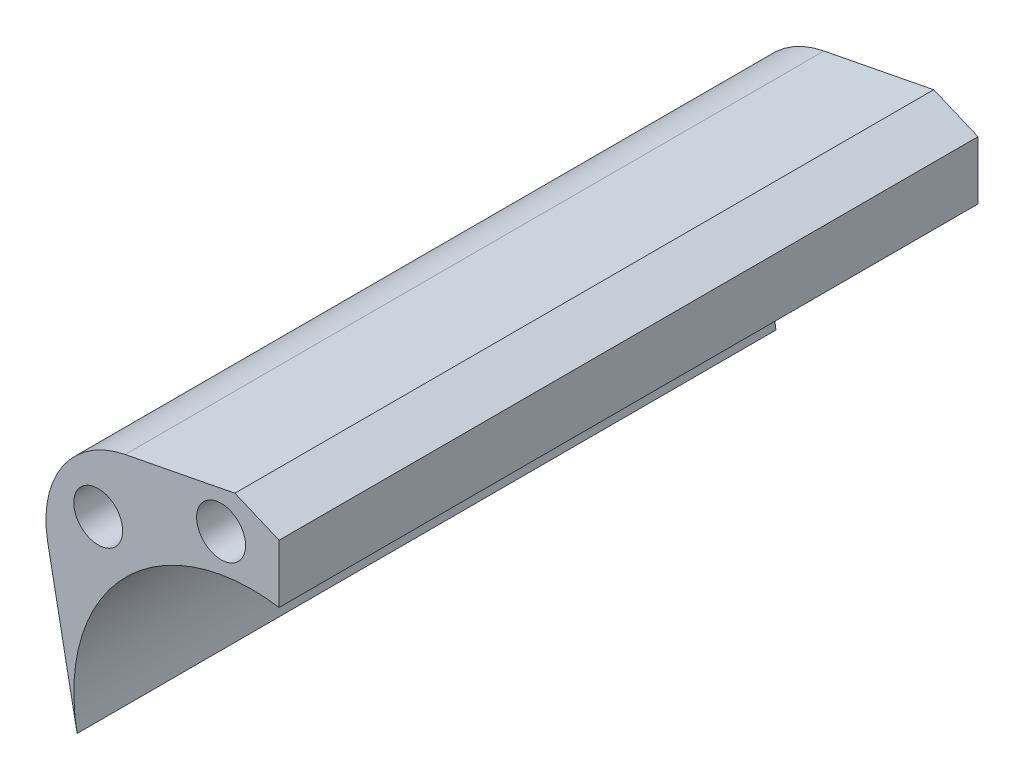
ISO-10303-21;
HEADER;
FILE_DESCRIPTION(('STEP AP214'),'2;1');
FILE_NAME('part.step','',(''),(''),'','','');
FILE_SCHEMA(('AUTOMOTIVE_DESIGN { 1 0 10303 214 1 1 1 1 }'));
ENDSEC;
DATA;
#1=APPLICATION_CONTEXT('core data for automotive mechanical design processes');
#2=APPLICATION_PROTOCOL_DEFINITION('international standard','automotive_design',2000,#1);
#3=PRODUCT_CONTEXT('',#1,'mechanical');
#4=PRODUCT('Part','Part','',(#3));
#5=PRODUCT_RELATED_PRODUCT_CATEGORY('part','',(#4));
#6=PRODUCT_DEFINITION_FORMATION('','',#4);
#7=PRODUCT_DEFINITION_CONTEXT('part definition',#1,'design');
#8=PRODUCT_DEFINITION('design','',#6,#7);
#9=PRODUCT_DEFINITION_SHAPE('','',#8);
#10=(LENGTH_UNIT() NAMED_UNIT(*) SI_UNIT(.MILLI.,.METRE.));
#11=(NAMED_UNIT(*) PLANE_ANGLE_UNIT() SI_UNIT($,.RADIAN.));
#12=(NAMED_UNIT(*) SI_UNIT($,.STERADIAN.) SOLID_ANGLE_UNIT());
#13=UNCERTAINTY_MEASURE_WITH_UNIT(LENGTH_MEASURE(1.E-05),#10,'distance_accuracy_value','');
#14=(GEOMETRIC_REPRESENTATION_CONTEXT(3) GLOBAL_UNCERTAINTY_ASSIGNED_CONTEXT((#13)) GLOBAL_UNIT_ASSIGNED_CONTEXT((#10,
#11,#12)) REPRESENTATION_CONTEXT('',''));
#15=CARTESIAN_POINT('',(0.,0.,0.));
#16=DIRECTION('',(0.,0.,1.));
#17=DIRECTION('',(1.,0.,0.));
#18=AXIS2_PLACEMENT_3D('',#15,#16,#17);
#19=CARTESIAN_POINT('',(-3.43636363636367,17.6689389879154,50.));
#20=DIRECTION('',(0.190909090909091,-0.981607721550857,0.));
#21=DIRECTION('',(0.981607721550857,0.190909090909091,0.));
#22=AXIS2_PLACEMENT_3D('',#19,#20,#21);
#23=PLANE('',#22);
#24=DIRECTION('',(-0.981607721550857,-0.190909090909091,0.));
#25=VECTOR('',#24,1.);
#26=CARTESIAN_POINT('',(-3.43636363636367,17.6689389879154,0.));
#27=LINE('',#26,#25);
#28=CARTESIAN_POINT('',(-1.22774626287425,18.0984844424609,0.));
#29=VERTEX_POINT('',#28);
#30=CARTESIAN_POINT('',(-9.08060803528111,16.5712117151882,0.));
#31=VERTEX_POINT('',#30);
#32=EDGE_CURVE('E126',#29,#31,#27,.T.);
#33=ORIENTED_EDGE('',*,*,#32,.T.);
#34=DIRECTION('',(0.,0.,-1.));
#35=VECTOR('',#34,1.);
#36=CARTESIAN_POINT('',(-9.08060803528111,16.5712117151882,50.));
#37=LINE('',#36,#35);
#38=CARTESIAN_POINT('',(-9.08060803528111,16.5712117151882,50.));
#39=VERTEX_POINT('',#38);
#40=EDGE_CURVE('E11',#39,#31,#37,.T.);
#41=ORIENTED_EDGE('',*,*,#40,.F.);
#42=DIRECTION('',(-0.981607721550857,-0.190909090909091,0.));
#43=VECTOR('',#42,1.);
#44=CARTESIAN_POINT('',(-3.43636363636367,17.6689389879154,50.));
#45=LINE('',#44,#43);
#46=CARTESIAN_POINT('',(-1.22774626287425,18.0984844424609,50.));
#47=VERTEX_POINT('',#46);
#48=EDGE_CURVE('E151',#47,#39,#45,.T.);
#49=ORIENTED_EDGE('',*,*,#48,.F.);
#50=DIRECTION('',(0.,0.,-1.));
#51=VECTOR('',#50,1.);
#52=CARTESIAN_POINT('',(-1.22774626287425,18.0984844424609,50.));
#53=LINE('',#52,#51);
#54=EDGE_CURVE('E116',#47,#29,#53,.T.);
#55=ORIENTED_EDGE('',*,*,#54,.T.);
#56=EDGE_LOOP('',(#33,#41,#49,#55));
#57=FACE_BOUND('',#56,.T.);
#58=ADVANCED_FACE('F37',(#57),#23,.F.);
#59=CARTESIAN_POINT('',(-7.74424439891748,9.69995766433215,50.));
#60=DIRECTION('',(0.,0.,-1.));
#61=DIRECTION('',(-1.,0.,0.));
#62=AXIS2_PLACEMENT_3D('',#59,#60,#61);
#63=CYLINDRICAL_SURFACE('',#62,7.);
#64=CARTESIAN_POINT('',(-7.74424439891748,9.69995766433215,0.));
#65=DIRECTION('',(0.,0.,1.));
#66=DIRECTION('',(1.,0.,0.));
#67=AXIS2_PLACEMENT_3D('',#64,#65,#66);
#68=CIRCLE('',#67,7.);
#69=CARTESIAN_POINT('',(-14.6154984497734,8.36359402796851,0.));
#70=VERTEX_POINT('',#69);
#71=EDGE_CURVE('E129',#31,#70,#68,.T.);
#72=ORIENTED_EDGE('',*,*,#71,.T.);
#73=DIRECTION('',(0.,0.,-1.));
#74=VECTOR('',#73,1.);
#75=CARTESIAN_POINT('',(-14.6154984497734,8.36359402796851,50.));
#76=LINE('',#75,#74);
#77=CARTESIAN_POINT('',(-14.6154984497734,8.36359402796851,50.));
#78=VERTEX_POINT('',#77);
#79=EDGE_CURVE('E46',#78,#70,#76,.T.);
#80=ORIENTED_EDGE('',*,*,#79,.F.);
#81=CARTESIAN_POINT('',(-7.74424439891748,9.69995766433215,50.));
#82=DIRECTION('',(0.,0.,1.));
#83=DIRECTION('',(1.,0.,0.));
#84=AXIS2_PLACEMENT_3D('',#81,#82,#83);
#85=CIRCLE('',#84,7.);
#86=EDGE_CURVE('E87',#39,#78,#85,.T.);
#87=ORIENTED_EDGE('',*,*,#86,.F.);
#88=ORIENTED_EDGE('',*,*,#40,.T.);
#89=EDGE_LOOP('',(#72,#80,#87,#88));
#90=FACE_BOUND('',#89,.T.);
#91=ADVANCED_FACE('F166',(#90),#63,.T.);
#92=CARTESIAN_POINT('',(-12.5154984497734,-2.43409090909092,50.));
#93=DIRECTION('',(0.981607721550857,0.190909090909092,0.));
#94=DIRECTION('',(-0.190909090909092,0.981607721550857,0.));
#95=AXIS2_PLACEMENT_3D('',#92,#93,#94);
#96=PLANE('',#95);
#97=DIRECTION('',(0.190909090909092,-0.981607721550857,0.));
#98=VECTOR('',#97,1.);
#99=CARTESIAN_POINT('',(-12.5154984497734,-2.43409090909092,0.));
#100=LINE('',#99,#98);
#101=CARTESIAN_POINT('',(-12.5154984497734,-2.4340909090909,0.));
#102=VERTEX_POINT('',#101);
#103=EDGE_CURVE('E131',#70,#102,#100,.T.);
#104=ORIENTED_EDGE('',*,*,#103,.T.);
#105=DIRECTION('',(0.,0.,-1.));
#106=VECTOR('',#105,1.);
#107=CARTESIAN_POINT('',(-12.5154984497734,-2.4340909090909,50.));
#108=LINE('',#107,#106);
#109=CARTESIAN_POINT('',(-12.5154984497734,-2.4340909090909,50.));
#110=VERTEX_POINT('',#109);
#111=EDGE_CURVE('E106',#110,#102,#108,.T.);
#112=ORIENTED_EDGE('',*,*,#111,.F.);
#113=DIRECTION('',(0.190909090909092,-0.981607721550857,0.));
#114=VECTOR('',#113,1.);
#115=CARTESIAN_POINT('',(-12.5154984497734,-2.43409090909092,50.));
#116=LINE('',#115,#114);
#117=EDGE_CURVE('E111',#78,#110,#116,.T.);
#118=ORIENTED_EDGE('',*,*,#117,.F.);
#119=ORIENTED_EDGE('',*,*,#79,.T.);
#120=EDGE_LOOP('',(#104,#112,#118,#119));
#121=FACE_BOUND('',#120,.T.);
#122=ADVANCED_FACE('F144',(#121),#96,.F.);
#123=CARTESIAN_POINT('',(0.,0.,50.));
#124=DIRECTION('',(0.,0.,-1.));
#125=DIRECTION('',(-1.,0.,0.));
#126=AXIS2_PLACEMENT_3D('',#123,#124,#125);
#127=CYLINDRICAL_SURFACE('',#126,12.75);
#128=CARTESIAN_POINT('',(0.,0.,0.));
#129=DIRECTION('',(0.,0.,1.));
#130=DIRECTION('',(1.,0.,0.));
#131=AXIS2_PLACEMENT_3D('',#128,#129,#130);
#132=CIRCLE('',#131,12.75);
#133=CARTESIAN_POINT('',(1.93912508650627,12.6016782175582,0.));
#134=VERTEX_POINT('',#133);
#135=EDGE_CURVE('E101',#134,#102,#132,.T.);
#136=ORIENTED_EDGE('',*,*,#135,.F.);
#137=DIRECTION('',(0.,0.,-1.));
#138=VECTOR('',#137,1.);
#139=CARTESIAN_POINT('',(1.93912508650627,12.6016782175582,50.));
#140=LINE('',#139,#138);
#141=CARTESIAN_POINT('',(1.93912508650627,12.6016782175582,50.));
#142=VERTEX_POINT('',#141);
#143=EDGE_CURVE('E96',#142,#134,#140,.T.);
#144=ORIENTED_EDGE('',*,*,#143,.F.);
#145=CARTESIAN_POINT('',(0.,0.,50.));
#146=DIRECTION('',(0.,0.,1.));
#147=DIRECTION('',(1.,0.,0.));
#148=AXIS2_PLACEMENT_3D('',#145,#146,#147);
#149=CIRCLE('',#148,12.75);
#150=EDGE_CURVE('E99',#142,#110,#149,.T.);
#151=ORIENTED_EDGE('',*,*,#150,.T.);
#152=ORIENTED_EDGE('',*,*,#111,.T.);
#153=EDGE_LOOP('',(#136,#144,#151,#152));
#154=FACE_BOUND('',#153,.T.);
#155=ADVANCED_FACE('F98',(#154),#127,.F.);
#156=CARTESIAN_POINT('',(1.93912508650627,0.,50.));
#157=DIRECTION('',(1.,0.,0.));
#158=DIRECTION('',(0.,1.,0.));
#159=AXIS2_PLACEMENT_3D('',#156,#157,#158);
#160=PLANE('',#159);
#161=DIRECTION('',(0.,-1.,0.));
#162=VECTOR('',#161,1.);
#163=CARTESIAN_POINT('',(1.93912508650627,0.,0.));
#164=LINE('',#163,#162);
#165=CARTESIAN_POINT('',(1.93912508650627,16.7708057259514,0.));
#166=VERTEX_POINT('',#165);
#167=EDGE_CURVE('E135',#166,#134,#164,.T.);
#168=ORIENTED_EDGE('',*,*,#167,.F.);
#169=DIRECTION('',(0.,0.,-1.));
#170=VECTOR('',#169,1.);
#171=CARTESIAN_POINT('',(1.93912508650627,16.7708057259514,50.));
#172=LINE('',#171,#170);
#173=CARTESIAN_POINT('',(1.93912508650627,16.7708057259514,50.));
#174=VERTEX_POINT('',#173);
#175=EDGE_CURVE('E76',#174,#166,#172,.T.);
#176=ORIENTED_EDGE('',*,*,#175,.F.);
#177=DIRECTION('',(0.,-1.,0.));
#178=VECTOR('',#177,1.);
#179=CARTESIAN_POINT('',(1.93912508650627,0.,50.));
#180=LINE('',#179,#178);
#181=EDGE_CURVE('E109',#174,#142,#180,.T.);
#182=ORIENTED_EDGE('',*,*,#181,.T.);
#183=ORIENTED_EDGE('',*,*,#143,.T.);
#184=EDGE_LOOP('',(#168,#176,#182,#183));
#185=FACE_BOUND('',#184,.T.);
#186=ADVANCED_FACE('F114',(#185),#160,.T.);
#187=CARTESIAN_POINT('',(-11.0058824735678,11.750641074318,50.));
#188=DIRECTION('',(0.,0.,-1.));
#189=DIRECTION('',(-1.,0.,0.));
#190=AXIS2_PLACEMENT_3D('',#187,#188,#189);
#191=CYLINDRICAL_SURFACE('',#190,1.75);
#192=CARTESIAN_POINT('',(-11.0058824735678,11.750641074318,50.));
#193=DIRECTION('',(0.,0.,1.));
#194=DIRECTION('',(1.,0.,0.));
#195=AXIS2_PLACEMENT_3D('',#192,#193,#194);
#196=CIRCLE('',#195,1.75);
#197=CARTESIAN_POINT('',(-9.25588247356776,11.750641074318,50.));
#198=VERTEX_POINT('',#197);
#199=EDGE_CURVE('E181',#198,#198,#196,.T.);
#200=ORIENTED_EDGE('',*,*,#199,.T.);
#201=EDGE_LOOP('',(#200));
#202=FACE_BOUND('',#201,.T.);
#203=CARTESIAN_POINT('',(-11.0058824735678,11.750641074318,0.));
#204=DIRECTION('',(0.,0.,1.));
#205=DIRECTION('',(1.,0.,0.));
#206=AXIS2_PLACEMENT_3D('',#203,#204,#205);
#207=CIRCLE('',#206,1.75);
#208=CARTESIAN_POINT('',(-9.25588247356776,11.750641074318,0.));
#209=VERTEX_POINT('',#208);
#210=EDGE_CURVE('E123',#209,#209,#207,.T.);
#211=ORIENTED_EDGE('',*,*,#210,.F.);
#212=EDGE_LOOP('',(#211));
#213=FACE_BOUND('',#212,.T.);
#214=ADVANCED_FACE('F161',(#202,#213),#191,.F.);
#215=CARTESIAN_POINT('',(-2.2140142652534,15.2348480788245,50.));
#216=DIRECTION('',(0.,0.,-1.));
#217=DIRECTION('',(-1.,0.,0.));
#218=AXIS2_PLACEMENT_3D('',#215,#216,#217);
#219=CYLINDRICAL_SURFACE('',#218,1.75);
#220=CARTESIAN_POINT('',(-2.2140142652534,15.2348480788245,50.));
#221=DIRECTION('',(0.,0.,1.));
#222=DIRECTION('',(1.,0.,0.));
#223=AXIS2_PLACEMENT_3D('',#220,#221,#222);
#224=CIRCLE('',#223,1.75);
#225=CARTESIAN_POINT('',(-0.464014265253402,15.2348480788245,50.));
#226=VERTEX_POINT('',#225);
#227=EDGE_CURVE('E138',#226,#226,#224,.T.);
#228=ORIENTED_EDGE('',*,*,#227,.T.);
#229=EDGE_LOOP('',(#228));
#230=FACE_BOUND('',#229,.T.);
#231=CARTESIAN_POINT('',(-2.2140142652534,15.2348480788245,0.));
#232=DIRECTION('',(0.,0.,1.));
#233=DIRECTION('',(1.,0.,0.));
#234=AXIS2_PLACEMENT_3D('',#231,#232,#233);
#235=CIRCLE('',#234,1.75);
#236=CARTESIAN_POINT('',(-0.464014265253402,15.2348480788245,0.));
#237=VERTEX_POINT('',#236);
#238=EDGE_CURVE('E120',#237,#237,#235,.T.);
#239=ORIENTED_EDGE('',*,*,#238,.F.);
#240=EDGE_LOOP('',(#239));
#241=FACE_BOUND('',#240,.T.);
#242=ADVANCED_FACE('F39',(#230,#241),#219,.F.);
#243=CARTESIAN_POINT('',(6.26981868017887,14.9552063290363,50.));
#244=DIRECTION('',(-0.386636499778735,-0.922232192584302,0.));
#245=DIRECTION('',(0.922232192584302,-0.386636499778735,0.));
#246=AXIS2_PLACEMENT_3D('',#243,#244,#245);
#247=PLANE('',#246);
#248=DIRECTION('',(-0.922232192584302,0.386636499778735,0.));
#249=VECTOR('',#248,1.);
#250=CARTESIAN_POINT('',(6.26981868017887,14.9552063290363,0.));
#251=LINE('',#250,#249);
#252=EDGE_CURVE('E79',#166,#29,#251,.T.);
#253=ORIENTED_EDGE('',*,*,#252,.T.);
#254=ORIENTED_EDGE('',*,*,#54,.F.);
#255=DIRECTION('',(-0.922232192584302,0.386636499778735,0.));
#256=VECTOR('',#255,1.);
#257=CARTESIAN_POINT('',(6.26981868017887,14.9552063290363,50.));
#258=LINE('',#257,#256);
#259=EDGE_CURVE('E54',#174,#47,#258,.T.);
#260=ORIENTED_EDGE('',*,*,#259,.F.);
#261=ORIENTED_EDGE('',*,*,#175,.T.);
#262=EDGE_LOOP('',(#253,#254,#260,#261));
#263=FACE_BOUND('',#262,.T.);
#264=ADVANCED_FACE('F152',(#263),#247,.F.);
#265=CARTESIAN_POINT('',(0.,0.,50.));
#266=DIRECTION('',(0.,0.,1.));
#267=DIRECTION('',(1.,0.,0.));
#268=AXIS2_PLACEMENT_3D('',#265,#266,#267);
#269=PLANE('',#268);
#270=ORIENTED_EDGE('',*,*,#227,.F.);
#271=EDGE_LOOP('',(#270));
#272=FACE_BOUND('',#271,.T.);
#273=ORIENTED_EDGE('',*,*,#199,.F.);
#274=EDGE_LOOP('',(#273));
#275=FACE_BOUND('',#274,.T.);
#276=ORIENTED_EDGE('',*,*,#48,.T.);
#277=ORIENTED_EDGE('',*,*,#86,.T.);
#278=ORIENTED_EDGE('',*,*,#117,.T.);
#279=ORIENTED_EDGE('',*,*,#150,.F.);
#280=ORIENTED_EDGE('',*,*,#181,.F.);
#281=ORIENTED_EDGE('',*,*,#259,.T.);
#282=EDGE_LOOP('',(#276,#277,#278,#279,#280,#281));
#283=FACE_BOUND('',#282,.T.);
#284=ADVANCED_FACE('F108',(#272,#275,#283),#269,.T.);
#285=CARTESIAN_POINT('',(0.,0.,0.));
#286=DIRECTION('',(0.,0.,1.));
#287=DIRECTION('',(1.,0.,0.));
#288=AXIS2_PLACEMENT_3D('',#285,#286,#287);
#289=PLANE('',#288);
#290=ORIENTED_EDGE('',*,*,#238,.T.);
#291=EDGE_LOOP('',(#290));
#292=FACE_BOUND('',#291,.T.);
#293=ORIENTED_EDGE('',*,*,#210,.T.);
#294=EDGE_LOOP('',(#293));
#295=FACE_BOUND('',#294,.T.);
#296=ORIENTED_EDGE('',*,*,#32,.F.);
#297=ORIENTED_EDGE('',*,*,#252,.F.);
#298=ORIENTED_EDGE('',*,*,#167,.T.);
#299=ORIENTED_EDGE('',*,*,#135,.T.);
#300=ORIENTED_EDGE('',*,*,#103,.F.);
#301=ORIENTED_EDGE('',*,*,#71,.F.);
#302=EDGE_LOOP('',(#296,#297,#298,#299,#300,#301));
#303=FACE_BOUND('',#302,.T.);
#304=ADVANCED_FACE('F147',(#292,#295,#303),#289,.F.);
#305=CLOSED_SHELL('',(#58,#91,#122,#155,#186,#214,#242,#264,#284,#304));
#306=MANIFOLD_SOLID_BREP('B2',#305);
#307=ADVANCED_BREP_SHAPE_REPRESENTATION('',(#18,#306),#14);
#308=SHAPE_DEFINITION_REPRESENTATION(#9,#307);
ENDSEC;
END-ISO-10303-21;
